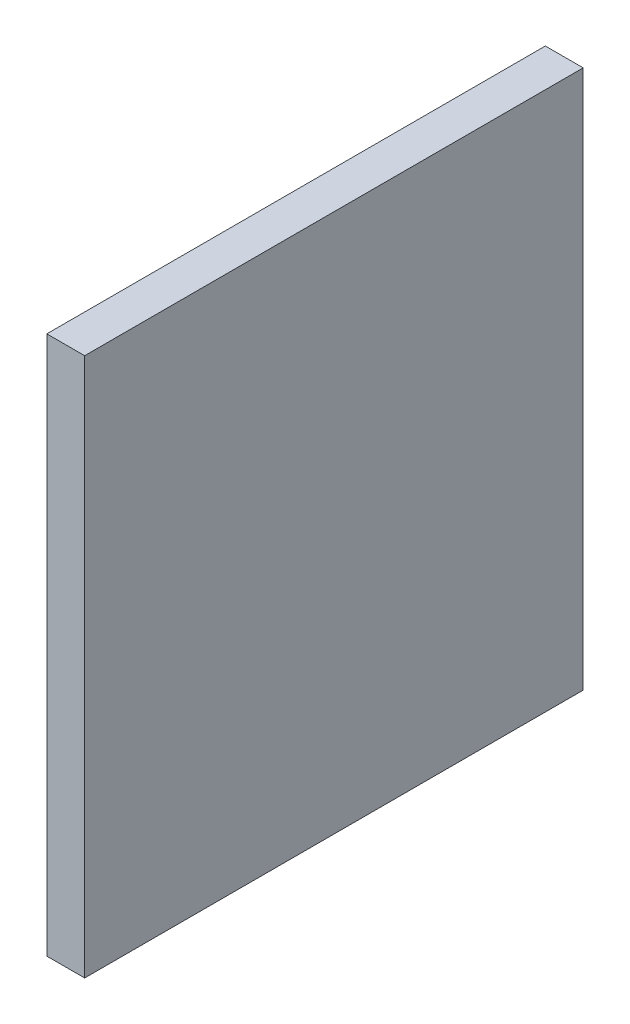
ISO-10303-21;
HEADER;
FILE_DESCRIPTION(('STEP AP214'),'2;1');
FILE_NAME('part.step','',(''),(''),'','','');
FILE_SCHEMA(('AUTOMOTIVE_DESIGN { 1 0 10303 214 1 1 1 1 }'));
ENDSEC;
DATA;
#1=APPLICATION_CONTEXT('core data for automotive mechanical design processes');
#2=APPLICATION_PROTOCOL_DEFINITION('international standard','automotive_design',2000,#1);
#3=PRODUCT_CONTEXT('',#1,'mechanical');
#4=PRODUCT('Part','Part','',(#3));
#5=PRODUCT_RELATED_PRODUCT_CATEGORY('part','',(#4));
#6=PRODUCT_DEFINITION_FORMATION('','',#4);
#7=PRODUCT_DEFINITION_CONTEXT('part definition',#1,'design');
#8=PRODUCT_DEFINITION('design','',#6,#7);
#9=PRODUCT_DEFINITION_SHAPE('','',#8);
#10=(LENGTH_UNIT() NAMED_UNIT(*) SI_UNIT(.MILLI.,.METRE.));
#11=(NAMED_UNIT(*) PLANE_ANGLE_UNIT() SI_UNIT($,.RADIAN.));
#12=(NAMED_UNIT(*) SI_UNIT($,.STERADIAN.) SOLID_ANGLE_UNIT());
#13=UNCERTAINTY_MEASURE_WITH_UNIT(LENGTH_MEASURE(1.E-05),#10,'distance_accuracy_value','');
#14=(GEOMETRIC_REPRESENTATION_CONTEXT(3) GLOBAL_UNCERTAINTY_ASSIGNED_CONTEXT((#13)) GLOBAL_UNIT_ASSIGNED_CONTEXT((#10,
#11,#12)) REPRESENTATION_CONTEXT('',''));
#15=CARTESIAN_POINT('',(0.,0.,0.));
#16=DIRECTION('',(0.,0.,1.));
#17=DIRECTION('',(1.,0.,0.));
#18=AXIS2_PLACEMENT_3D('',#15,#16,#17);
#19=CARTESIAN_POINT('',(6.,0.,0.));
#20=DIRECTION('',(0.,0.,-1.));
#21=DIRECTION('',(-1.,0.,0.));
#22=AXIS2_PLACEMENT_3D('',#19,#20,#21);
#23=PLANE('',#22);
#24=DIRECTION('',(0.,-1.,0.));
#25=VECTOR('',#24,1.);
#26=CARTESIAN_POINT('',(0.,0.,0.));
#27=LINE('',#26,#25);
#28=CARTESIAN_POINT('',(0.,85.4,0.));
#29=VERTEX_POINT('',#28);
#30=CARTESIAN_POINT('',(0.,0.,0.));
#31=VERTEX_POINT('',#30);
#32=EDGE_CURVE('E99',#29,#31,#27,.T.);
#33=ORIENTED_EDGE('',*,*,#32,.T.);
#34=DIRECTION('',(-1.,0.,0.));
#35=VECTOR('',#34,1.);
#36=CARTESIAN_POINT('',(6.,0.,0.));
#37=LINE('',#36,#35);
#38=CARTESIAN_POINT('',(6.,0.,0.));
#39=VERTEX_POINT('',#38);
#40=EDGE_CURVE('E11',#39,#31,#37,.T.);
#41=ORIENTED_EDGE('',*,*,#40,.F.);
#42=DIRECTION('',(0.,-1.,0.));
#43=VECTOR('',#42,1.);
#44=CARTESIAN_POINT('',(6.,0.,0.));
#45=LINE('',#44,#43);
#46=CARTESIAN_POINT('',(6.,85.4,0.));
#47=VERTEX_POINT('',#46);
#48=EDGE_CURVE('E87',#47,#39,#45,.T.);
#49=ORIENTED_EDGE('',*,*,#48,.F.);
#50=DIRECTION('',(-1.,0.,0.));
#51=VECTOR('',#50,1.);
#52=CARTESIAN_POINT('',(6.,85.4,0.));
#53=LINE('',#52,#51);
#54=EDGE_CURVE('E95',#47,#29,#53,.T.);
#55=ORIENTED_EDGE('',*,*,#54,.T.);
#56=EDGE_LOOP('',(#33,#41,#49,#55));
#57=FACE_BOUND('',#56,.T.);
#58=ADVANCED_FACE('F36',(#57),#23,.F.);
#59=CARTESIAN_POINT('',(6.,0.,0.));
#60=DIRECTION('',(0.,1.,0.));
#61=DIRECTION('',(0.,0.,1.));
#62=AXIS2_PLACEMENT_3D('',#59,#60,#61);
#63=PLANE('',#62);
#64=DIRECTION('',(0.,0.,-1.));
#65=VECTOR('',#64,1.);
#66=CARTESIAN_POINT('',(0.,0.,0.));
#67=LINE('',#66,#65);
#68=CARTESIAN_POINT('',(0.,0.,-79.));
#69=VERTEX_POINT('',#68);
#70=EDGE_CURVE('E91',#31,#69,#67,.T.);
#71=ORIENTED_EDGE('',*,*,#70,.T.);
#72=DIRECTION('',(-1.,0.,0.));
#73=VECTOR('',#72,1.);
#74=CARTESIAN_POINT('',(6.,0.,-79.));
#75=LINE('',#74,#73);
#76=CARTESIAN_POINT('',(6.,0.,-79.));
#77=VERTEX_POINT('',#76);
#78=EDGE_CURVE('E44',#77,#69,#75,.T.);
#79=ORIENTED_EDGE('',*,*,#78,.F.);
#80=DIRECTION('',(0.,0.,-1.));
#81=VECTOR('',#80,1.);
#82=CARTESIAN_POINT('',(6.,0.,0.));
#83=LINE('',#82,#81);
#84=EDGE_CURVE('E82',#39,#77,#83,.T.);
#85=ORIENTED_EDGE('',*,*,#84,.F.);
#86=ORIENTED_EDGE('',*,*,#40,.T.);
#87=EDGE_LOOP('',(#71,#79,#85,#86));
#88=FACE_BOUND('',#87,.T.);
#89=ADVANCED_FACE('F90',(#88),#63,.F.);
#90=CARTESIAN_POINT('',(6.,0.,-79.));
#91=DIRECTION('',(0.,0.,1.));
#92=DIRECTION('',(1.,0.,0.));
#93=AXIS2_PLACEMENT_3D('',#90,#91,#92);
#94=PLANE('',#93);
#95=DIRECTION('',(0.,1.,0.));
#96=VECTOR('',#95,1.);
#97=CARTESIAN_POINT('',(0.,0.,-79.));
#98=LINE('',#97,#96);
#99=CARTESIAN_POINT('',(0.,85.4,-79.));
#100=VERTEX_POINT('',#99);
#101=EDGE_CURVE('E69',#69,#100,#98,.T.);
#102=ORIENTED_EDGE('',*,*,#101,.T.);
#103=DIRECTION('',(-1.,0.,0.));
#104=VECTOR('',#103,1.);
#105=CARTESIAN_POINT('',(6.,85.4,-79.));
#106=LINE('',#105,#104);
#107=CARTESIAN_POINT('',(6.,85.4,-79.));
#108=VERTEX_POINT('',#107);
#109=EDGE_CURVE('E92',#108,#100,#106,.T.);
#110=ORIENTED_EDGE('',*,*,#109,.F.);
#111=DIRECTION('',(0.,1.,0.));
#112=VECTOR('',#111,1.);
#113=CARTESIAN_POINT('',(6.,0.,-79.));
#114=LINE('',#113,#112);
#115=EDGE_CURVE('E85',#77,#108,#114,.T.);
#116=ORIENTED_EDGE('',*,*,#115,.F.);
#117=ORIENTED_EDGE('',*,*,#78,.T.);
#118=EDGE_LOOP('',(#102,#110,#116,#117));
#119=FACE_BOUND('',#118,.T.);
#120=ADVANCED_FACE('F93',(#119),#94,.F.);
#121=CARTESIAN_POINT('',(6.,85.4,0.));
#122=DIRECTION('',(0.,-1.,0.));
#123=DIRECTION('',(0.,0.,-1.));
#124=AXIS2_PLACEMENT_3D('',#121,#122,#123);
#125=PLANE('',#124);
#126=DIRECTION('',(0.,0.,1.));
#127=VECTOR('',#126,1.);
#128=CARTESIAN_POINT('',(0.,85.4,0.));
#129=LINE('',#128,#127);
#130=EDGE_CURVE('E75',#100,#29,#129,.T.);
#131=ORIENTED_EDGE('',*,*,#130,.T.);
#132=ORIENTED_EDGE('',*,*,#54,.F.);
#133=DIRECTION('',(0.,0.,1.));
#134=VECTOR('',#133,1.);
#135=CARTESIAN_POINT('',(6.,85.4,0.));
#136=LINE('',#135,#134);
#137=EDGE_CURVE('E52',#108,#47,#136,.T.);
#138=ORIENTED_EDGE('',*,*,#137,.F.);
#139=ORIENTED_EDGE('',*,*,#109,.T.);
#140=EDGE_LOOP('',(#131,#132,#138,#139));
#141=FACE_BOUND('',#140,.T.);
#142=ADVANCED_FACE('F106',(#141),#125,.F.);
#143=CARTESIAN_POINT('',(6.,0.,0.));
#144=DIRECTION('',(-1.,0.,0.));
#145=DIRECTION('',(0.,0.,1.));
#146=AXIS2_PLACEMENT_3D('',#143,#144,#145);
#147=PLANE('',#146);
#148=ORIENTED_EDGE('',*,*,#48,.T.);
#149=ORIENTED_EDGE('',*,*,#84,.T.);
#150=ORIENTED_EDGE('',*,*,#115,.T.);
#151=ORIENTED_EDGE('',*,*,#137,.T.);
#152=EDGE_LOOP('',(#148,#149,#150,#151));
#153=FACE_BOUND('',#152,.T.);
#154=ADVANCED_FACE('F83',(#153),#147,.F.);
#155=CARTESIAN_POINT('',(0.,0.,0.));
#156=DIRECTION('',(-1.,0.,0.));
#157=DIRECTION('',(0.,0.,1.));
#158=AXIS2_PLACEMENT_3D('',#155,#156,#157);
#159=PLANE('',#158);
#160=ORIENTED_EDGE('',*,*,#32,.F.);
#161=ORIENTED_EDGE('',*,*,#130,.F.);
#162=ORIENTED_EDGE('',*,*,#101,.F.);
#163=ORIENTED_EDGE('',*,*,#70,.F.);
#164=EDGE_LOOP('',(#160,#161,#162,#163));
#165=FACE_BOUND('',#164,.T.);
#166=ADVANCED_FACE('F109',(#165),#159,.T.);
#167=CLOSED_SHELL('',(#58,#89,#120,#142,#154,#166));
#168=MANIFOLD_SOLID_BREP('B2',#167);
#169=ADVANCED_BREP_SHAPE_REPRESENTATION('',(#18,#168),#14);
#170=SHAPE_DEFINITION_REPRESENTATION(#9,#169);
ENDSEC;
END-ISO-10303-21;
